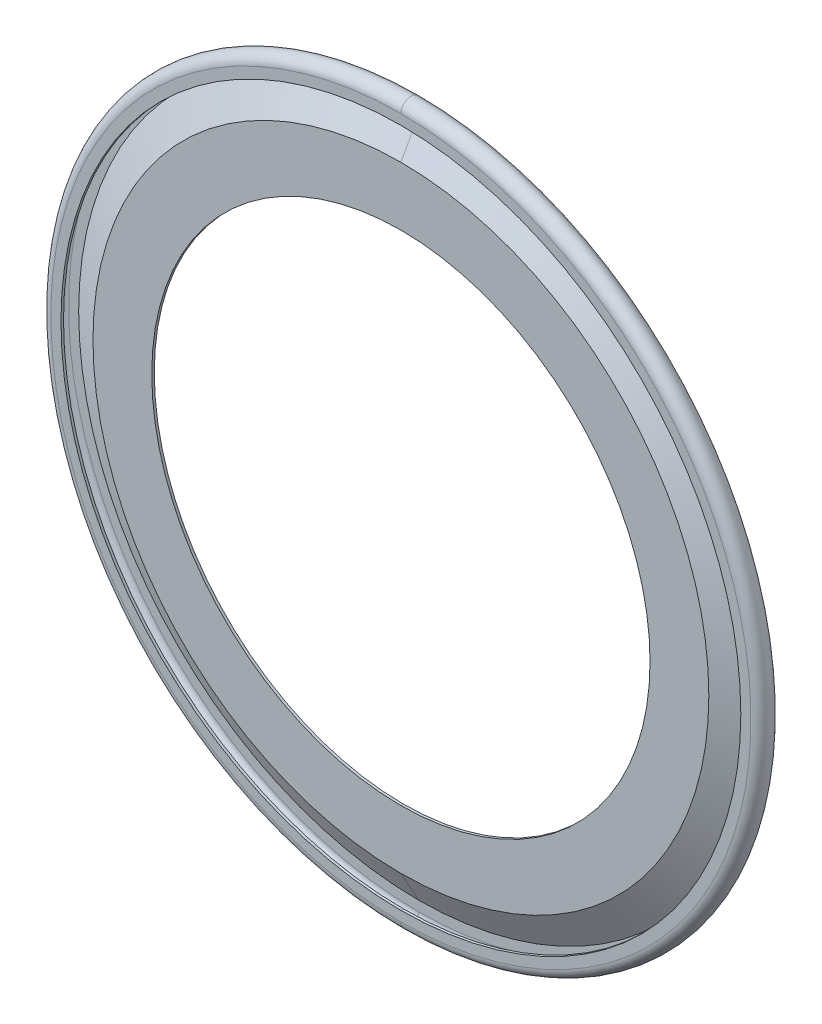
ISO-10303-21;
HEADER;
FILE_DESCRIPTION(('STEP AP214'),'2;1');
FILE_NAME('part.step','',(''),(''),'','','');
FILE_SCHEMA(('AUTOMOTIVE_DESIGN { 1 0 10303 214 1 1 1 1 }'));
ENDSEC;
DATA;
#1=APPLICATION_CONTEXT('core data for automotive mechanical design processes');
#2=APPLICATION_PROTOCOL_DEFINITION('international standard','automotive_design',2000,#1);
#3=PRODUCT_CONTEXT('',#1,'mechanical');
#4=PRODUCT('Part','Part','',(#3));
#5=PRODUCT_RELATED_PRODUCT_CATEGORY('part','',(#4));
#6=PRODUCT_DEFINITION_FORMATION('','',#4);
#7=PRODUCT_DEFINITION_CONTEXT('part definition',#1,'design');
#8=PRODUCT_DEFINITION('design','',#6,#7);
#9=PRODUCT_DEFINITION_SHAPE('','',#8);
#10=(LENGTH_UNIT() NAMED_UNIT(*) SI_UNIT(.MILLI.,.METRE.));
#11=(NAMED_UNIT(*) PLANE_ANGLE_UNIT() SI_UNIT($,.RADIAN.));
#12=(NAMED_UNIT(*) SI_UNIT($,.STERADIAN.) SOLID_ANGLE_UNIT());
#13=UNCERTAINTY_MEASURE_WITH_UNIT(LENGTH_MEASURE(1.E-05),#10,'distance_accuracy_value','');
#14=(GEOMETRIC_REPRESENTATION_CONTEXT(3) GLOBAL_UNCERTAINTY_ASSIGNED_CONTEXT((#13)) GLOBAL_UNIT_ASSIGNED_CONTEXT((#10,
#11,#12)) REPRESENTATION_CONTEXT('',''));
#15=CARTESIAN_POINT('',(0.,0.,0.));
#16=DIRECTION('',(0.,0.,1.));
#17=DIRECTION('',(1.,0.,0.));
#18=AXIS2_PLACEMENT_3D('',#15,#16,#17);
#19=CARTESIAN_POINT('',(0.,0.,2.11935238315688));
#20=DIRECTION('',(0.,0.,-1.));
#21=DIRECTION('',(0.,-1.,0.));
#22=AXIS2_PLACEMENT_3D('',#19,#20,#21);
#23=CONICAL_SURFACE('',#22,5.78748739723392,1.06593495513583);
#24=DIRECTION('',(0.,0.8752415354393,-0.483686111690068));
#25=VECTOR('',#24,1.);
#26=CARTESIAN_POINT('',(0.,5.80766790008927,2.10819999999998));
#27=LINE('',#26,#25);
#28=CARTESIAN_POINT('',(0.,5.80766790008927,2.10819999999999));
#29=VERTEX_POINT('',#28);
#30=CARTESIAN_POINT('',(0.,6.41091790008929,1.77482500000001));
#31=VERTEX_POINT('',#30);
#32=EDGE_CURVE('E20',#29,#31,#27,.T.);
#33=ORIENTED_EDGE('',*,*,#32,.F.);
#34=CARTESIAN_POINT('',(0.,0.,2.10819999999998));
#35=DIRECTION('',(0.,0.,-1.));
#36=DIRECTION('',(0.,1.,0.));
#37=AXIS2_PLACEMENT_3D('',#34,#35,#36);
#38=CIRCLE('',#37,5.80766790008927);
#39=CARTESIAN_POINT('',(0.,-5.80766790008927,2.10819999999999));
#40=VERTEX_POINT('',#39);
#41=EDGE_CURVE('E176',#29,#40,#38,.T.);
#42=ORIENTED_EDGE('',*,*,#41,.T.);
#43=DIRECTION('',(0.,-0.8752415354393,-0.483686111690068));
#44=VECTOR('',#43,1.);
#45=CARTESIAN_POINT('',(0.,-5.80766790008927,2.10819999999998));
#46=LINE('',#45,#44);
#47=CARTESIAN_POINT('',(0.,-6.41091790008929,1.77482500000001));
#48=VERTEX_POINT('',#47);
#49=EDGE_CURVE('E184',#40,#48,#46,.T.);
#50=ORIENTED_EDGE('',*,*,#49,.T.);
#51=CARTESIAN_POINT('',(0.,0.,1.77482500000002));
#52=DIRECTION('',(0.,0.,1.));
#53=DIRECTION('',(0.,-1.,0.));
#54=AXIS2_PLACEMENT_3D('',#51,#52,#53);
#55=CIRCLE('',#54,6.4109179000893);
#56=EDGE_CURVE('E191',#48,#31,#55,.T.);
#57=ORIENTED_EDGE('',*,*,#56,.T.);
#58=EDGE_LOOP('',(#33,#42,#50,#57));
#59=FACE_BOUND('',#58,.T.);
#60=ADVANCED_FACE('F17',(#59),#23,.T.);
#61=CARTESIAN_POINT('',(0.,0.,2.61366));
#62=DIRECTION('',(0.,0.,-1.));
#63=DIRECTION('',(0.,-1.,0.));
#64=AXIS2_PLACEMENT_3D('',#61,#62,#63);
#65=CYLINDRICAL_SURFACE('',#64,6.41091790008928);
#66=DIRECTION('',(0.,0.,1.));
#67=VECTOR('',#66,1.);
#68=CARTESIAN_POINT('',(0.,6.41091790008928,2.060575));
#69=LINE('',#68,#67);
#70=CARTESIAN_POINT('',(0.,6.41091790008928,2.060575));
#71=VERTEX_POINT('',#70);
#72=CARTESIAN_POINT('',(0.,6.41091790008928,2.1082));
#73=VERTEX_POINT('',#72);
#74=EDGE_CURVE('E25',#71,#73,#69,.T.);
#75=ORIENTED_EDGE('',*,*,#74,.T.);
#76=CARTESIAN_POINT('',(0.,0.,2.1082));
#77=DIRECTION('',(0.,0.,1.));
#78=DIRECTION('',(0.,1.,0.));
#79=AXIS2_PLACEMENT_3D('',#76,#77,#78);
#80=CIRCLE('',#79,6.41091790008928);
#81=CARTESIAN_POINT('',(0.,-6.41091790008928,2.1082));
#82=VERTEX_POINT('',#81);
#83=EDGE_CURVE('E135',#73,#82,#80,.T.);
#84=ORIENTED_EDGE('',*,*,#83,.T.);
#85=DIRECTION('',(0.,0.,-1.));
#86=VECTOR('',#85,1.);
#87=CARTESIAN_POINT('',(0.,-6.41091790008928,2.1082));
#88=LINE('',#87,#86);
#89=CARTESIAN_POINT('',(0.,-6.41091790008928,2.060575));
#90=VERTEX_POINT('',#89);
#91=EDGE_CURVE('E11',#82,#90,#88,.T.);
#92=ORIENTED_EDGE('',*,*,#91,.T.);
#93=CARTESIAN_POINT('',(0.,0.,2.060575));
#94=DIRECTION('',(0.,0.,-1.));
#95=DIRECTION('',(0.,-1.,0.));
#96=AXIS2_PLACEMENT_3D('',#93,#94,#95);
#97=CIRCLE('',#96,6.41091790008928);
#98=EDGE_CURVE('E214',#90,#71,#97,.T.);
#99=ORIENTED_EDGE('',*,*,#98,.T.);
#100=EDGE_LOOP('',(#75,#84,#92,#99));
#101=FACE_BOUND('',#100,.T.);
#102=ADVANCED_FACE('F218',(#101),#65,.F.);
#103=CARTESIAN_POINT('',(0.,0.,2.61366));
#104=DIRECTION('',(0.,0.,-1.));
#105=DIRECTION('',(0.,-1.,0.));
#106=AXIS2_PLACEMENT_3D('',#103,#104,#105);
#107=CYLINDRICAL_SURFACE('',#106,6.41091790008928);
#108=ORIENTED_EDGE('',*,*,#91,.F.);
#109=CARTESIAN_POINT('',(0.,0.,2.1082));
#110=DIRECTION('',(0.,0.,1.));
#111=DIRECTION('',(0.,-1.,0.));
#112=AXIS2_PLACEMENT_3D('',#109,#110,#111);
#113=CIRCLE('',#112,6.41091790008928);
#114=EDGE_CURVE('E122',#82,#73,#113,.T.);
#115=ORIENTED_EDGE('',*,*,#114,.T.);
#116=ORIENTED_EDGE('',*,*,#74,.F.);
#117=CARTESIAN_POINT('',(0.,0.,2.060575));
#118=DIRECTION('',(0.,0.,-1.));
#119=DIRECTION('',(0.,1.,0.));
#120=AXIS2_PLACEMENT_3D('',#117,#118,#119);
#121=CIRCLE('',#120,6.41091790008928);
#122=EDGE_CURVE('E209',#71,#90,#121,.T.);
#123=ORIENTED_EDGE('',*,*,#122,.T.);
#124=EDGE_LOOP('',(#108,#115,#116,#123));
#125=FACE_BOUND('',#124,.T.);
#126=ADVANCED_FACE('F225',(#125),#107,.F.);
#127=CARTESIAN_POINT('',(0.,0.,2.060575));
#128=DIRECTION('',(0.,0.,1.));
#129=DIRECTION('',(0.,1.,0.));
#130=AXIS2_PLACEMENT_3D('',#127,#128,#129);
#131=PLANE('',#130);
#132=ORIENTED_EDGE('',*,*,#98,.F.);
#133=ORIENTED_EDGE('',*,*,#122,.F.);
#134=EDGE_LOOP('',(#132,#133));
#135=FACE_BOUND('',#134,.T.);
#136=CARTESIAN_POINT('',(0.,0.,2.060575));
#137=DIRECTION('',(0.,0.,1.));
#138=DIRECTION('',(0.,-1.,0.));
#139=AXIS2_PLACEMENT_3D('',#136,#137,#138);
#140=CIRCLE('',#139,6.60141790008928);
#141=CARTESIAN_POINT('',(0.,-6.60141790008928,2.060575));
#142=VERTEX_POINT('',#141);
#143=CARTESIAN_POINT('',(0.,6.60141790008928,2.060575));
#144=VERTEX_POINT('',#143);
#145=EDGE_CURVE('E199',#142,#144,#140,.T.);
#146=ORIENTED_EDGE('',*,*,#145,.F.);
#147=CARTESIAN_POINT('',(0.,0.,2.060575));
#148=DIRECTION('',(0.,0.,1.));
#149=DIRECTION('',(0.,1.,0.));
#150=AXIS2_PLACEMENT_3D('',#147,#148,#149);
#151=CIRCLE('',#150,6.60141790008928);
#152=EDGE_CURVE('E201',#144,#142,#151,.T.);
#153=ORIENTED_EDGE('',*,*,#152,.F.);
#154=EDGE_LOOP('',(#146,#153));
#155=FACE_BOUND('',#154,.T.);
#156=ADVANCED_FACE('F274',(#135,#155),#131,.F.);
#157=CARTESIAN_POINT('',(0.,0.,1.9177));
#158=DIRECTION('',(0.,0.,1.));
#159=DIRECTION('',(0.,1.,0.));
#160=AXIS2_PLACEMENT_3D('',#157,#158,#159);
#161=TOROIDAL_SURFACE('',#160,6.60141790008928,0.142875);
#162=ORIENTED_EDGE('',*,*,#152,.T.);
#163=CARTESIAN_POINT('',(0.,-6.60141790008928,1.9177));
#164=DIRECTION('',(1.,0.,0.));
#165=DIRECTION('',(0.,0.,1.));
#166=AXIS2_PLACEMENT_3D('',#163,#164,#165);
#167=CIRCLE('',#166,0.142875);
#168=CARTESIAN_POINT('',(0.,-6.74429290008928,1.9177));
#169=VERTEX_POINT('',#168);
#170=EDGE_CURVE('E196',#142,#169,#167,.T.);
#171=ORIENTED_EDGE('',*,*,#170,.T.);
#172=CARTESIAN_POINT('',(0.,-6.60141790008928,1.9177));
#173=DIRECTION('',(1.,0.,0.));
#174=DIRECTION('',(0.,-1.,0.));
#175=AXIS2_PLACEMENT_3D('',#172,#173,#174);
#176=CIRCLE('',#175,0.142875);
#177=CARTESIAN_POINT('',(0.,-6.60141790008928,1.774825));
#178=VERTEX_POINT('',#177);
#179=EDGE_CURVE('E198',#169,#178,#176,.T.);
#180=ORIENTED_EDGE('',*,*,#179,.T.);
#181=CARTESIAN_POINT('',(0.,0.,1.774825));
#182=DIRECTION('',(0.,0.,-1.));
#183=DIRECTION('',(0.,-1.,0.));
#184=AXIS2_PLACEMENT_3D('',#181,#182,#183);
#185=CIRCLE('',#184,6.60141790008928);
#186=CARTESIAN_POINT('',(0.,6.60141790008928,1.774825));
#187=VERTEX_POINT('',#186);
#188=EDGE_CURVE('E189',#178,#187,#185,.T.);
#189=ORIENTED_EDGE('',*,*,#188,.T.);
#190=CARTESIAN_POINT('',(0.,6.60141790008928,1.9177));
#191=DIRECTION('',(-1.,0.,0.));
#192=DIRECTION('',(0.,1.,0.));
#193=AXIS2_PLACEMENT_3D('',#190,#191,#192);
#194=CIRCLE('',#193,0.142875);
#195=CARTESIAN_POINT('',(0.,6.74429290008928,1.9177));
#196=VERTEX_POINT('',#195);
#197=EDGE_CURVE('E193',#196,#187,#194,.T.);
#198=ORIENTED_EDGE('',*,*,#197,.F.);
#199=CARTESIAN_POINT('',(0.,6.60141790008928,1.9177));
#200=DIRECTION('',(-1.,0.,0.));
#201=DIRECTION('',(0.,0.,1.));
#202=AXIS2_PLACEMENT_3D('',#199,#200,#201);
#203=CIRCLE('',#202,0.142875);
#204=EDGE_CURVE('E202',#144,#196,#203,.T.);
#205=ORIENTED_EDGE('',*,*,#204,.F.);
#206=EDGE_LOOP('',(#162,#171,#180,#189,#198,#205));
#207=FACE_BOUND('',#206,.T.);
#208=ADVANCED_FACE('F270',(#207),#161,.F.);
#209=CARTESIAN_POINT('',(0.,0.,1.9177));
#210=DIRECTION('',(0.,0.,1.));
#211=DIRECTION('',(0.,1.,0.));
#212=AXIS2_PLACEMENT_3D('',#209,#210,#211);
#213=TOROIDAL_SURFACE('',#212,6.60141790008928,0.142875);
#214=CARTESIAN_POINT('',(0.,0.,1.774825));
#215=DIRECTION('',(0.,0.,-1.));
#216=DIRECTION('',(0.,1.,0.));
#217=AXIS2_PLACEMENT_3D('',#214,#215,#216);
#218=CIRCLE('',#217,6.60141790008928);
#219=EDGE_CURVE('E186',#187,#178,#218,.T.);
#220=ORIENTED_EDGE('',*,*,#219,.T.);
#221=ORIENTED_EDGE('',*,*,#179,.F.);
#222=ORIENTED_EDGE('',*,*,#170,.F.);
#223=ORIENTED_EDGE('',*,*,#145,.T.);
#224=ORIENTED_EDGE('',*,*,#204,.T.);
#225=ORIENTED_EDGE('',*,*,#197,.T.);
#226=EDGE_LOOP('',(#220,#221,#222,#223,#224,#225));
#227=FACE_BOUND('',#226,.T.);
#228=ADVANCED_FACE('F266',(#227),#213,.F.);
#229=CARTESIAN_POINT('',(0.,0.,1.774825));
#230=DIRECTION('',(0.,0.,1.));
#231=DIRECTION('',(0.,1.,0.));
#232=AXIS2_PLACEMENT_3D('',#229,#230,#231);
#233=PLANE('',#232);
#234=CARTESIAN_POINT('',(0.,0.,1.77482500000002));
#235=DIRECTION('',(0.,0.,1.));
#236=DIRECTION('',(0.,1.,0.));
#237=AXIS2_PLACEMENT_3D('',#234,#235,#236);
#238=CIRCLE('',#237,6.4109179000893);
#239=EDGE_CURVE('E179',#31,#48,#238,.T.);
#240=ORIENTED_EDGE('',*,*,#239,.F.);
#241=ORIENTED_EDGE('',*,*,#56,.F.);
#242=EDGE_LOOP('',(#240,#241));
#243=FACE_BOUND('',#242,.T.);
#244=ORIENTED_EDGE('',*,*,#188,.F.);
#245=ORIENTED_EDGE('',*,*,#219,.F.);
#246=EDGE_LOOP('',(#244,#245));
#247=FACE_BOUND('',#246,.T.);
#248=ADVANCED_FACE('F260',(#243,#247),#233,.T.);
#249=CARTESIAN_POINT('',(0.,0.,2.11935238315688));
#250=DIRECTION('',(0.,0.,-1.));
#251=DIRECTION('',(0.,-1.,0.));
#252=AXIS2_PLACEMENT_3D('',#249,#250,#251);
#253=CONICAL_SURFACE('',#252,5.78748739723392,1.06593495513583);
#254=ORIENTED_EDGE('',*,*,#49,.F.);
#255=CARTESIAN_POINT('',(0.,0.,2.10819999999998));
#256=DIRECTION('',(0.,0.,-1.));
#257=DIRECTION('',(0.,-1.,0.));
#258=AXIS2_PLACEMENT_3D('',#255,#256,#257);
#259=CIRCLE('',#258,5.80766790008927);
#260=EDGE_CURVE('E173',#40,#29,#259,.T.);
#261=ORIENTED_EDGE('',*,*,#260,.T.);
#262=ORIENTED_EDGE('',*,*,#32,.T.);
#263=ORIENTED_EDGE('',*,*,#239,.T.);
#264=EDGE_LOOP('',(#254,#261,#262,#263));
#265=FACE_BOUND('',#264,.T.);
#266=ADVANCED_FACE('F246',(#265),#253,.T.);
#267=CARTESIAN_POINT('',(0.,0.,2.1082));
#268=DIRECTION('',(0.,0.,-1.));
#269=DIRECTION('',(0.,-1.,0.));
#270=AXIS2_PLACEMENT_3D('',#267,#268,#269);
#271=PLANE('',#270);
#272=CARTESIAN_POINT('',(0.,0.,2.1082));
#273=DIRECTION('',(0.,0.,1.));
#274=DIRECTION('',(0.,1.,0.));
#275=AXIS2_PLACEMENT_3D('',#272,#273,#274);
#276=CIRCLE('',#275,4.699);
#277=CARTESIAN_POINT('',(0.,4.699,2.1082));
#278=VERTEX_POINT('',#277);
#279=CARTESIAN_POINT('',(0.,-4.699,2.1082));
#280=VERTEX_POINT('',#279);
#281=EDGE_CURVE('E170',#278,#280,#276,.T.);
#282=ORIENTED_EDGE('',*,*,#281,.F.);
#283=CARTESIAN_POINT('',(0.,0.,2.1082));
#284=DIRECTION('',(0.,0.,1.));
#285=DIRECTION('',(0.,-1.,0.));
#286=AXIS2_PLACEMENT_3D('',#283,#284,#285);
#287=CIRCLE('',#286,4.699);
#288=EDGE_CURVE('E177',#280,#278,#287,.T.);
#289=ORIENTED_EDGE('',*,*,#288,.F.);
#290=EDGE_LOOP('',(#282,#289));
#291=FACE_BOUND('',#290,.T.);
#292=ORIENTED_EDGE('',*,*,#41,.F.);
#293=ORIENTED_EDGE('',*,*,#260,.F.);
#294=EDGE_LOOP('',(#292,#293));
#295=FACE_BOUND('',#294,.T.);
#296=ADVANCED_FACE('F248',(#291,#295),#271,.F.);
#297=CARTESIAN_POINT('',(0.,0.,2.12725));
#298=DIRECTION('',(0.,0.,-1.));
#299=DIRECTION('',(0.,-1.,0.));
#300=AXIS2_PLACEMENT_3D('',#297,#298,#299);
#301=CYLINDRICAL_SURFACE('',#300,4.699);
#302=CARTESIAN_POINT('',(0.,0.,2.060575));
#303=DIRECTION('',(0.,0.,-1.));
#304=DIRECTION('',(0.,1.,0.));
#305=AXIS2_PLACEMENT_3D('',#302,#303,#304);
#306=CIRCLE('',#305,4.699);
#307=CARTESIAN_POINT('',(0.,4.699,2.060575));
#308=VERTEX_POINT('',#307);
#309=CARTESIAN_POINT('',(0.,-4.699,2.060575));
#310=VERTEX_POINT('',#309);
#311=EDGE_CURVE('E164',#308,#310,#306,.T.);
#312=ORIENTED_EDGE('',*,*,#311,.T.);
#313=DIRECTION('',(0.,0.,1.));
#314=VECTOR('',#313,1.);
#315=CARTESIAN_POINT('',(0.,-4.699,2.060575));
#316=LINE('',#315,#314);
#317=EDGE_CURVE('E167',#310,#280,#316,.T.);
#318=ORIENTED_EDGE('',*,*,#317,.T.);
#319=ORIENTED_EDGE('',*,*,#288,.T.);
#320=DIRECTION('',(0.,0.,1.));
#321=VECTOR('',#320,1.);
#322=CARTESIAN_POINT('',(0.,4.699,2.060575));
#323=LINE('',#322,#321);
#324=EDGE_CURVE('E166',#308,#278,#323,.T.);
#325=ORIENTED_EDGE('',*,*,#324,.F.);
#326=EDGE_LOOP('',(#312,#318,#319,#325));
#327=FACE_BOUND('',#326,.T.);
#328=ADVANCED_FACE('F250',(#327),#301,.F.);
#329=CARTESIAN_POINT('',(0.,0.,2.12725));
#330=DIRECTION('',(0.,0.,-1.));
#331=DIRECTION('',(0.,-1.,0.));
#332=AXIS2_PLACEMENT_3D('',#329,#330,#331);
#333=CYLINDRICAL_SURFACE('',#332,4.699);
#334=ORIENTED_EDGE('',*,*,#281,.T.);
#335=ORIENTED_EDGE('',*,*,#317,.F.);
#336=CARTESIAN_POINT('',(0.,0.,2.060575));
#337=DIRECTION('',(0.,0.,-1.));
#338=DIRECTION('',(0.,-1.,0.));
#339=AXIS2_PLACEMENT_3D('',#336,#337,#338);
#340=CIRCLE('',#339,4.699);
#341=EDGE_CURVE('E161',#310,#308,#340,.T.);
#342=ORIENTED_EDGE('',*,*,#341,.T.);
#343=ORIENTED_EDGE('',*,*,#324,.T.);
#344=EDGE_LOOP('',(#334,#335,#342,#343));
#345=FACE_BOUND('',#344,.T.);
#346=ADVANCED_FACE('F257',(#345),#333,.F.);
#347=CARTESIAN_POINT('',(0.,0.,2.060575));
#348=DIRECTION('',(0.,0.,-1.));
#349=DIRECTION('',(0.,-1.,0.));
#350=AXIS2_PLACEMENT_3D('',#347,#348,#349);
#351=PLANE('',#350);
#352=ORIENTED_EDGE('',*,*,#311,.F.);
#353=ORIENTED_EDGE('',*,*,#341,.F.);
#354=EDGE_LOOP('',(#352,#353));
#355=FACE_BOUND('',#354,.T.);
#356=CARTESIAN_POINT('',(0.,0.,2.06057499999998));
#357=DIRECTION('',(0.,0.,1.));
#358=DIRECTION('',(0.,1.,0.));
#359=AXIS2_PLACEMENT_3D('',#356,#357,#358);
#360=CIRCLE('',#359,5.80766790008927);
#361=CARTESIAN_POINT('',(0.,5.80766790008927,2.06057499999999));
#362=VERTEX_POINT('',#361);
#363=CARTESIAN_POINT('',(0.,-5.80766790008927,2.06057499999999));
#364=VERTEX_POINT('',#363);
#365=EDGE_CURVE('E156',#362,#364,#360,.T.);
#366=ORIENTED_EDGE('',*,*,#365,.F.);
#367=CARTESIAN_POINT('',(0.,0.,2.06057499999998));
#368=DIRECTION('',(0.,0.,1.));
#369=DIRECTION('',(0.,-1.,0.));
#370=AXIS2_PLACEMENT_3D('',#367,#368,#369);
#371=CIRCLE('',#370,5.80766790008927);
#372=EDGE_CURVE('E152',#364,#362,#371,.T.);
#373=ORIENTED_EDGE('',*,*,#372,.F.);
#374=EDGE_LOOP('',(#366,#373));
#375=FACE_BOUND('',#374,.T.);
#376=ADVANCED_FACE('F322',(#355,#375),#351,.T.);
#377=CARTESIAN_POINT('',(0.,0.,2.07172738315688));
#378=DIRECTION('',(0.,0.,-1.));
#379=DIRECTION('',(0.,-1.,0.));
#380=AXIS2_PLACEMENT_3D('',#377,#378,#379);
#381=CONICAL_SURFACE('',#380,5.78748739723392,1.06593495513583);
#382=ORIENTED_EDGE('',*,*,#365,.T.);
#383=DIRECTION('',(0.,0.8752415354393,0.483686111690068));
#384=VECTOR('',#383,1.);
#385=CARTESIAN_POINT('',(0.,-6.4109179000893,1.72720000000002));
#386=LINE('',#385,#384);
#387=CARTESIAN_POINT('',(0.,-6.41091790008929,1.72720000000001));
#388=VERTEX_POINT('',#387);
#389=EDGE_CURVE('E153',#388,#364,#386,.T.);
#390=ORIENTED_EDGE('',*,*,#389,.F.);
#391=CARTESIAN_POINT('',(0.,0.,1.72720000000002));
#392=DIRECTION('',(0.,0.,-1.));
#393=DIRECTION('',(0.,-1.,0.));
#394=AXIS2_PLACEMENT_3D('',#391,#392,#393);
#395=CIRCLE('',#394,6.4109179000893);
#396=CARTESIAN_POINT('',(0.,6.41091790008929,1.72720000000001));
#397=VERTEX_POINT('',#396);
#398=EDGE_CURVE('E147',#388,#397,#395,.T.);
#399=ORIENTED_EDGE('',*,*,#398,.T.);
#400=DIRECTION('',(0.,-0.8752415354393,0.483686111690068));
#401=VECTOR('',#400,1.);
#402=CARTESIAN_POINT('',(0.,6.4109179000893,1.72720000000002));
#403=LINE('',#402,#401);
#404=EDGE_CURVE('E149',#397,#362,#403,.T.);
#405=ORIENTED_EDGE('',*,*,#404,.T.);
#406=EDGE_LOOP('',(#382,#390,#399,#405));
#407=FACE_BOUND('',#406,.T.);
#408=ADVANCED_FACE('F329',(#407),#381,.F.);
#409=CARTESIAN_POINT('',(0.,0.,2.07172738315688));
#410=DIRECTION('',(0.,0.,-1.));
#411=DIRECTION('',(0.,-1.,0.));
#412=AXIS2_PLACEMENT_3D('',#409,#410,#411);
#413=CONICAL_SURFACE('',#412,5.78748739723392,1.06593495513583);
#414=CARTESIAN_POINT('',(0.,0.,1.72720000000002));
#415=DIRECTION('',(0.,0.,-1.));
#416=DIRECTION('',(0.,1.,0.));
#417=AXIS2_PLACEMENT_3D('',#414,#415,#416);
#418=CIRCLE('',#417,6.4109179000893);
#419=EDGE_CURVE('E143',#397,#388,#418,.T.);
#420=ORIENTED_EDGE('',*,*,#419,.T.);
#421=ORIENTED_EDGE('',*,*,#389,.T.);
#422=ORIENTED_EDGE('',*,*,#372,.T.);
#423=ORIENTED_EDGE('',*,*,#404,.F.);
#424=EDGE_LOOP('',(#420,#421,#422,#423));
#425=FACE_BOUND('',#424,.T.);
#426=ADVANCED_FACE('F337',(#425),#413,.F.);
#427=CARTESIAN_POINT('',(0.,0.,1.7272));
#428=DIRECTION('',(0.,0.,-1.));
#429=DIRECTION('',(0.,-1.,0.));
#430=AXIS2_PLACEMENT_3D('',#427,#428,#429);
#431=PLANE('',#430);
#432=ORIENTED_EDGE('',*,*,#398,.F.);
#433=ORIENTED_EDGE('',*,*,#419,.F.);
#434=EDGE_LOOP('',(#432,#433));
#435=FACE_BOUND('',#434,.T.);
#436=CARTESIAN_POINT('',(0.,0.,1.7272));
#437=DIRECTION('',(0.,0.,1.));
#438=DIRECTION('',(0.,1.,0.));
#439=AXIS2_PLACEMENT_3D('',#436,#437,#438);
#440=CIRCLE('',#439,6.60141790008928);
#441=CARTESIAN_POINT('',(0.,6.60141790008928,1.7272));
#442=VERTEX_POINT('',#441);
#443=CARTESIAN_POINT('',(0.,-6.60141790008928,1.7272));
#444=VERTEX_POINT('',#443);
#445=EDGE_CURVE('E138',#442,#444,#440,.T.);
#446=ORIENTED_EDGE('',*,*,#445,.F.);
#447=CARTESIAN_POINT('',(0.,0.,1.7272));
#448=DIRECTION('',(0.,0.,1.));
#449=DIRECTION('',(0.,-1.,0.));
#450=AXIS2_PLACEMENT_3D('',#447,#448,#449);
#451=CIRCLE('',#450,6.60141790008928);
#452=EDGE_CURVE('E141',#444,#442,#451,.T.);
#453=ORIENTED_EDGE('',*,*,#452,.F.);
#454=EDGE_LOOP('',(#446,#453));
#455=FACE_BOUND('',#454,.T.);
#456=ADVANCED_FACE('F345',(#435,#455),#431,.T.);
#457=CARTESIAN_POINT('',(0.,0.,1.9177));
#458=DIRECTION('',(0.,0.,-1.));
#459=DIRECTION('',(0.,-1.,0.));
#460=AXIS2_PLACEMENT_3D('',#457,#458,#459);
#461=TOROIDAL_SURFACE('',#460,6.60141790008928,0.1905);
#462=CARTESIAN_POINT('',(0.,0.,2.1082));
#463=DIRECTION('',(0.,0.,-1.));
#464=DIRECTION('',(0.,1.,0.));
#465=AXIS2_PLACEMENT_3D('',#462,#463,#464);
#466=CIRCLE('',#465,6.60141790008928);
#467=CARTESIAN_POINT('',(0.,6.60141790008928,2.1082));
#468=VERTEX_POINT('',#467);
#469=CARTESIAN_POINT('',(0.,-6.60141790008928,2.1082));
#470=VERTEX_POINT('',#469);
#471=EDGE_CURVE('E116',#468,#470,#466,.T.);
#472=ORIENTED_EDGE('',*,*,#471,.T.);
#473=CARTESIAN_POINT('',(0.,-6.60141790008928,1.9177));
#474=DIRECTION('',(1.,0.,0.));
#475=DIRECTION('',(0.,0.,1.));
#476=AXIS2_PLACEMENT_3D('',#473,#474,#475);
#477=CIRCLE('',#476,0.1905);
#478=CARTESIAN_POINT('',(0.,-6.79191790008928,1.9177));
#479=VERTEX_POINT('',#478);
#480=EDGE_CURVE('E32',#470,#479,#477,.T.);
#481=ORIENTED_EDGE('',*,*,#480,.T.);
#482=CARTESIAN_POINT('',(0.,-6.60141790008928,1.9177));
#483=DIRECTION('',(1.,0.,0.));
#484=DIRECTION('',(0.,-1.,0.));
#485=AXIS2_PLACEMENT_3D('',#482,#483,#484);
#486=CIRCLE('',#485,0.1905);
#487=EDGE_CURVE('E128',#479,#444,#486,.T.);
#488=ORIENTED_EDGE('',*,*,#487,.T.);
#489=ORIENTED_EDGE('',*,*,#452,.T.);
#490=CARTESIAN_POINT('',(0.,6.60141790008928,1.9177));
#491=DIRECTION('',(-1.,0.,0.));
#492=DIRECTION('',(0.,1.,0.));
#493=AXIS2_PLACEMENT_3D('',#490,#491,#492);
#494=CIRCLE('',#493,0.1905);
#495=CARTESIAN_POINT('',(0.,6.79191790008928,1.9177));
#496=VERTEX_POINT('',#495);
#497=EDGE_CURVE('E39',#496,#442,#494,.T.);
#498=ORIENTED_EDGE('',*,*,#497,.F.);
#499=CARTESIAN_POINT('',(0.,6.60141790008928,1.9177));
#500=DIRECTION('',(-1.,0.,0.));
#501=DIRECTION('',(0.,0.,1.));
#502=AXIS2_PLACEMENT_3D('',#499,#500,#501);
#503=CIRCLE('',#502,0.1905);
#504=EDGE_CURVE('E118',#468,#496,#503,.T.);
#505=ORIENTED_EDGE('',*,*,#504,.F.);
#506=EDGE_LOOP('',(#472,#481,#488,#489,#498,#505));
#507=FACE_BOUND('',#506,.T.);
#508=ADVANCED_FACE('F117',(#507),#461,.T.);
#509=CARTESIAN_POINT('',(0.,0.,1.9177));
#510=DIRECTION('',(0.,0.,-1.));
#511=DIRECTION('',(0.,-1.,0.));
#512=AXIS2_PLACEMENT_3D('',#509,#510,#511);
#513=TOROIDAL_SURFACE('',#512,6.60141790008928,0.1905);
#514=ORIENTED_EDGE('',*,*,#445,.T.);
#515=ORIENTED_EDGE('',*,*,#487,.F.);
#516=ORIENTED_EDGE('',*,*,#480,.F.);
#517=CARTESIAN_POINT('',(0.,0.,2.1082));
#518=DIRECTION('',(0.,0.,-1.));
#519=DIRECTION('',(0.,-1.,0.));
#520=AXIS2_PLACEMENT_3D('',#517,#518,#519);
#521=CIRCLE('',#520,6.60141790008928);
#522=EDGE_CURVE('E123',#470,#468,#521,.T.);
#523=ORIENTED_EDGE('',*,*,#522,.T.);
#524=ORIENTED_EDGE('',*,*,#504,.T.);
#525=ORIENTED_EDGE('',*,*,#497,.T.);
#526=EDGE_LOOP('',(#514,#515,#516,#523,#524,#525));
#527=FACE_BOUND('',#526,.T.);
#528=ADVANCED_FACE('F127',(#527),#513,.T.);
#529=CARTESIAN_POINT('',(0.,0.,2.1082));
#530=DIRECTION('',(0.,0.,-1.));
#531=DIRECTION('',(0.,-1.,0.));
#532=AXIS2_PLACEMENT_3D('',#529,#530,#531);
#533=PLANE('',#532);
#534=ORIENTED_EDGE('',*,*,#83,.F.);
#535=ORIENTED_EDGE('',*,*,#114,.F.);
#536=EDGE_LOOP('',(#534,#535));
#537=FACE_BOUND('',#536,.T.);
#538=ORIENTED_EDGE('',*,*,#471,.F.);
#539=ORIENTED_EDGE('',*,*,#522,.F.);
#540=EDGE_LOOP('',(#538,#539));
#541=FACE_BOUND('',#540,.T.);
#542=ADVANCED_FACE('F130',(#537,#541),#533,.F.);
#543=CLOSED_SHELL('',(#60,#102,#126,#156,#208,#228,#248,#266,#296,#328,#346,#376,#408,#426,#456,
#508,#528,#542));
#544=MANIFOLD_SOLID_BREP('B1',#543);
#545=ADVANCED_BREP_SHAPE_REPRESENTATION('',(#18,#544),#14);
#546=SHAPE_DEFINITION_REPRESENTATION(#9,#545);
ENDSEC;
END-ISO-10303-21;
